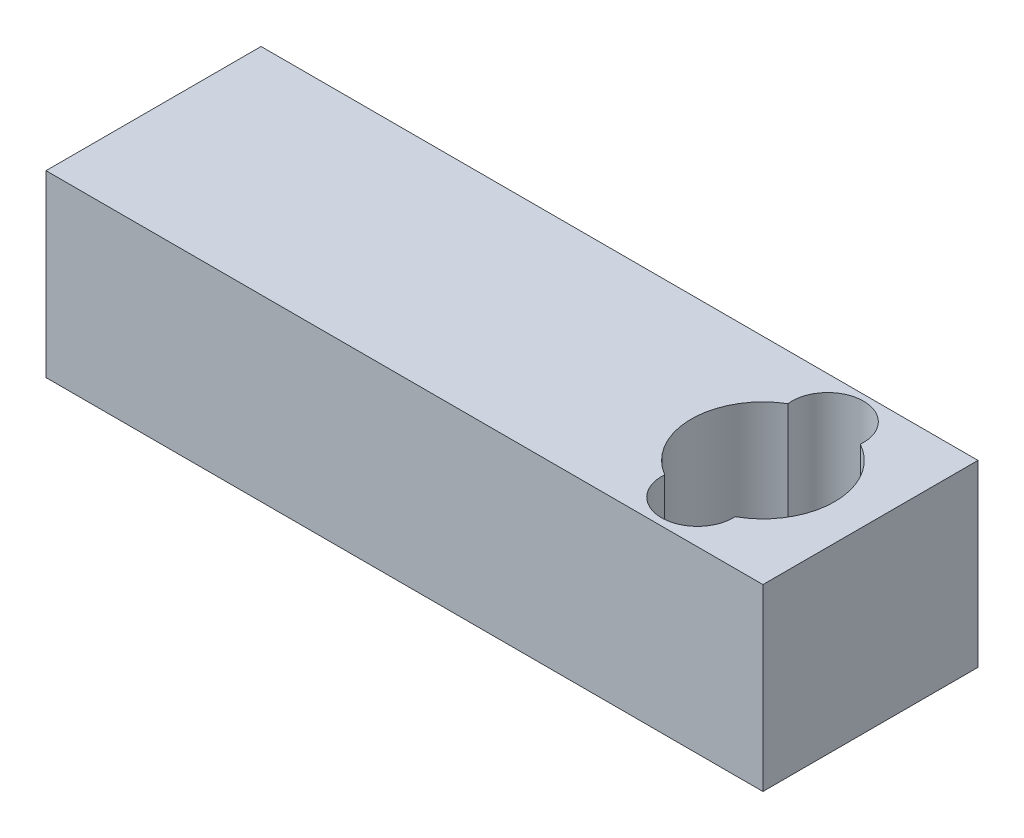
ISO-10303-21;
HEADER;
FILE_DESCRIPTION(('STEP AP214'),'2;1');
FILE_NAME('part.step','',(''),(''),'','','');
FILE_SCHEMA(('AUTOMOTIVE_DESIGN { 1 0 10303 214 1 1 1 1 }'));
ENDSEC;
DATA;
#1=APPLICATION_CONTEXT('core data for automotive mechanical design processes');
#2=APPLICATION_PROTOCOL_DEFINITION('international standard','automotive_design',2000,#1);
#3=PRODUCT_CONTEXT('',#1,'mechanical');
#4=PRODUCT('Part','Part','',(#3));
#5=PRODUCT_RELATED_PRODUCT_CATEGORY('part','',(#4));
#6=PRODUCT_DEFINITION_FORMATION('','',#4);
#7=PRODUCT_DEFINITION_CONTEXT('part definition',#1,'design');
#8=PRODUCT_DEFINITION('design','',#6,#7);
#9=PRODUCT_DEFINITION_SHAPE('','',#8);
#10=(LENGTH_UNIT() NAMED_UNIT(*) SI_UNIT(.MILLI.,.METRE.));
#11=(NAMED_UNIT(*) PLANE_ANGLE_UNIT() SI_UNIT($,.RADIAN.));
#12=(NAMED_UNIT(*) SI_UNIT($,.STERADIAN.) SOLID_ANGLE_UNIT());
#13=UNCERTAINTY_MEASURE_WITH_UNIT(LENGTH_MEASURE(1.E-05),#10,'distance_accuracy_value','');
#14=(GEOMETRIC_REPRESENTATION_CONTEXT(3) GLOBAL_UNCERTAINTY_ASSIGNED_CONTEXT((#13)) GLOBAL_UNIT_ASSIGNED_CONTEXT((#10,
#11,#12)) REPRESENTATION_CONTEXT('',''));
#15=CARTESIAN_POINT('',(0.,0.,0.));
#16=DIRECTION('',(0.,0.,1.));
#17=DIRECTION('',(1.,0.,0.));
#18=AXIS2_PLACEMENT_3D('',#15,#16,#17);
#19=CARTESIAN_POINT('',(50.,25.,0.));
#20=DIRECTION('',(1.,0.,0.));
#21=DIRECTION('',(0.,0.,-1.));
#22=AXIS2_PLACEMENT_3D('',#19,#20,#21);
#23=PLANE('',#22);
#24=DIRECTION('',(0.,0.,1.));
#25=VECTOR('',#24,1.);
#26=CARTESIAN_POINT('',(50.,0.,0.));
#27=LINE('',#26,#25);
#28=CARTESIAN_POINT('',(50.,0.,-15.));
#29=VERTEX_POINT('',#28);
#30=CARTESIAN_POINT('',(50.,0.,15.));
#31=VERTEX_POINT('',#30);
#32=EDGE_CURVE('E147',#29,#31,#27,.T.);
#33=ORIENTED_EDGE('',*,*,#32,.F.);
#34=DIRECTION('',(0.,-1.,0.));
#35=VECTOR('',#34,1.);
#36=CARTESIAN_POINT('',(50.,25.,-15.));
#37=LINE('',#36,#35);
#38=CARTESIAN_POINT('',(50.,25.,-15.));
#39=VERTEX_POINT('',#38);
#40=EDGE_CURVE('E11',#39,#29,#37,.T.);
#41=ORIENTED_EDGE('',*,*,#40,.F.);
#42=DIRECTION('',(0.,0.,1.));
#43=VECTOR('',#42,1.);
#44=CARTESIAN_POINT('',(50.,25.,0.));
#45=LINE('',#44,#43);
#46=CARTESIAN_POINT('',(50.,25.,15.));
#47=VERTEX_POINT('',#46);
#48=EDGE_CURVE('E129',#39,#47,#45,.T.);
#49=ORIENTED_EDGE('',*,*,#48,.T.);
#50=DIRECTION('',(0.,-1.,0.));
#51=VECTOR('',#50,1.);
#52=CARTESIAN_POINT('',(50.,25.,15.));
#53=LINE('',#52,#51);
#54=EDGE_CURVE('E91',#47,#31,#53,.T.);
#55=ORIENTED_EDGE('',*,*,#54,.T.);
#56=EDGE_LOOP('',(#33,#41,#49,#55));
#57=FACE_BOUND('',#56,.T.);
#58=ADVANCED_FACE('F37',(#57),#23,.T.);
#59=CARTESIAN_POINT('',(0.,25.,-15.));
#60=DIRECTION('',(0.,0.,-1.));
#61=DIRECTION('',(-1.,0.,0.));
#62=AXIS2_PLACEMENT_3D('',#59,#60,#61);
#63=PLANE('',#62);
#64=DIRECTION('',(1.,0.,0.));
#65=VECTOR('',#64,1.);
#66=CARTESIAN_POINT('',(0.,0.,-15.));
#67=LINE('',#66,#65);
#68=CARTESIAN_POINT('',(-50.,0.,-15.));
#69=VERTEX_POINT('',#68);
#70=EDGE_CURVE('E119',#69,#29,#67,.T.);
#71=ORIENTED_EDGE('',*,*,#70,.F.);
#72=DIRECTION('',(0.,-1.,0.));
#73=VECTOR('',#72,1.);
#74=CARTESIAN_POINT('',(-50.,25.,-15.));
#75=LINE('',#74,#73);
#76=CARTESIAN_POINT('',(-50.,25.,-15.));
#77=VERTEX_POINT('',#76);
#78=EDGE_CURVE('E47',#77,#69,#75,.T.);
#79=ORIENTED_EDGE('',*,*,#78,.F.);
#80=DIRECTION('',(1.,0.,0.));
#81=VECTOR('',#80,1.);
#82=CARTESIAN_POINT('',(0.,25.,-15.));
#83=LINE('',#82,#81);
#84=EDGE_CURVE('E117',#77,#39,#83,.T.);
#85=ORIENTED_EDGE('',*,*,#84,.T.);
#86=ORIENTED_EDGE('',*,*,#40,.T.);
#87=EDGE_LOOP('',(#71,#79,#85,#86));
#88=FACE_BOUND('',#87,.T.);
#89=ADVANCED_FACE('F115',(#88),#63,.T.);
#90=CARTESIAN_POINT('',(-50.,25.,0.));
#91=DIRECTION('',(1.,0.,0.));
#92=DIRECTION('',(0.,0.,-1.));
#93=AXIS2_PLACEMENT_3D('',#90,#91,#92);
#94=PLANE('',#93);
#95=DIRECTION('',(0.,0.,1.));
#96=VECTOR('',#95,1.);
#97=CARTESIAN_POINT('',(-50.,0.,0.));
#98=LINE('',#97,#96);
#99=CARTESIAN_POINT('',(-50.,0.,15.));
#100=VERTEX_POINT('',#99);
#101=EDGE_CURVE('E150',#69,#100,#98,.T.);
#102=ORIENTED_EDGE('',*,*,#101,.T.);
#103=DIRECTION('',(0.,-1.,0.));
#104=VECTOR('',#103,1.);
#105=CARTESIAN_POINT('',(-50.,25.,15.));
#106=LINE('',#105,#104);
#107=CARTESIAN_POINT('',(-50.,25.,15.));
#108=VERTEX_POINT('',#107);
#109=EDGE_CURVE('E122',#108,#100,#106,.T.);
#110=ORIENTED_EDGE('',*,*,#109,.F.);
#111=DIRECTION('',(0.,0.,1.));
#112=VECTOR('',#111,1.);
#113=CARTESIAN_POINT('',(-50.,25.,0.));
#114=LINE('',#113,#112);
#115=EDGE_CURVE('E125',#77,#108,#114,.T.);
#116=ORIENTED_EDGE('',*,*,#115,.F.);
#117=ORIENTED_EDGE('',*,*,#78,.T.);
#118=EDGE_LOOP('',(#102,#110,#116,#117));
#119=FACE_BOUND('',#118,.T.);
#120=ADVANCED_FACE('F126',(#119),#94,.F.);
#121=CARTESIAN_POINT('',(34.8709193944947,25.,9.00691121945326));
#122=DIRECTION('',(0.,-1.,0.));
#123=DIRECTION('',(0.,0.,-1.));
#124=AXIS2_PLACEMENT_3D('',#121,#122,#123);
#125=CYLINDRICAL_SURFACE('',#124,5.);
#126=CARTESIAN_POINT('',(34.8709193944947,0.,9.00691121945326));
#127=DIRECTION('',(0.,1.,0.));
#128=DIRECTION('',(0.,0.,1.));
#129=AXIS2_PLACEMENT_3D('',#126,#127,#128);
#130=CIRCLE('',#129,5.);
#131=CARTESIAN_POINT('',(29.8879494579652,0.,8.59458778858428));
#132=VERTEX_POINT('',#131);
#133=CARTESIAN_POINT('',(39.8636587115314,0.,8.73755251416235));
#134=VERTEX_POINT('',#133);
#135=EDGE_CURVE('E137',#132,#134,#130,.T.);
#136=ORIENTED_EDGE('',*,*,#135,.F.);
#137=DIRECTION('',(0.,-1.,0.));
#138=VECTOR('',#137,1.);
#139=CARTESIAN_POINT('',(29.8879494579652,25.,8.59458778858428));
#140=LINE('',#139,#138);
#141=CARTESIAN_POINT('',(29.8879494579652,25.,8.59458778858428));
#142=VERTEX_POINT('',#141);
#143=EDGE_CURVE('E41',#142,#132,#140,.T.);
#144=ORIENTED_EDGE('',*,*,#143,.F.);
#145=CARTESIAN_POINT('',(34.8709193944947,25.,9.00691121945326));
#146=DIRECTION('',(0.,1.,0.));
#147=DIRECTION('',(0.,0.,1.));
#148=AXIS2_PLACEMENT_3D('',#145,#146,#147);
#149=CIRCLE('',#148,5.);
#150=CARTESIAN_POINT('',(39.8636587115314,25.,8.73755251416235));
#151=VERTEX_POINT('',#150);
#152=EDGE_CURVE('E153',#142,#151,#149,.T.);
#153=ORIENTED_EDGE('',*,*,#152,.T.);
#154=DIRECTION('',(0.,-1.,0.));
#155=VECTOR('',#154,1.);
#156=CARTESIAN_POINT('',(39.8636587115314,25.,8.73755251416235));
#157=LINE('',#156,#155);
#158=EDGE_CURVE('E136',#151,#134,#157,.T.);
#159=ORIENTED_EDGE('',*,*,#158,.T.);
#160=EDGE_LOOP('',(#136,#144,#153,#159));
#161=FACE_BOUND('',#160,.T.);
#162=ADVANCED_FACE('F39',(#161),#125,.F.);
#163=CARTESIAN_POINT('',(35.,25.,0.));
#164=DIRECTION('',(0.,-1.,0.));
#165=DIRECTION('',(0.,0.,-1.));
#166=AXIS2_PLACEMENT_3D('',#163,#164,#165);
#167=CYLINDRICAL_SURFACE('',#166,10.);
#168=CARTESIAN_POINT('',(35.,0.,0.));
#169=DIRECTION('',(0.,1.,0.));
#170=DIRECTION('',(0.,0.,1.));
#171=AXIS2_PLACEMENT_3D('',#168,#169,#170);
#172=CIRCLE('',#171,10.);
#173=CARTESIAN_POINT('',(29.8879494579652,0.,-8.59458778858429));
#174=VERTEX_POINT('',#173);
#175=EDGE_CURVE('E140',#174,#132,#172,.T.);
#176=ORIENTED_EDGE('',*,*,#175,.F.);
#177=DIRECTION('',(0.,-1.,0.));
#178=VECTOR('',#177,1.);
#179=CARTESIAN_POINT('',(29.8879494579652,25.,-8.59458778858429));
#180=LINE('',#179,#178);
#181=CARTESIAN_POINT('',(29.8879494579652,25.,-8.59458778858429));
#182=VERTEX_POINT('',#181);
#183=EDGE_CURVE('E158',#182,#174,#180,.T.);
#184=ORIENTED_EDGE('',*,*,#183,.F.);
#185=CARTESIAN_POINT('',(35.,25.,0.));
#186=DIRECTION('',(0.,1.,0.));
#187=DIRECTION('',(0.,0.,1.));
#188=AXIS2_PLACEMENT_3D('',#185,#186,#187);
#189=CIRCLE('',#188,10.);
#190=EDGE_CURVE('E167',#182,#142,#189,.T.);
#191=ORIENTED_EDGE('',*,*,#190,.T.);
#192=ORIENTED_EDGE('',*,*,#143,.T.);
#193=EDGE_LOOP('',(#176,#184,#191,#192));
#194=FACE_BOUND('',#193,.T.);
#195=ADVANCED_FACE('F165',(#194),#167,.F.);
#196=CARTESIAN_POINT('',(34.8530861902551,25.,-9.18400888564987));
#197=DIRECTION('',(0.,-1.,0.));
#198=DIRECTION('',(0.,0.,-1.));
#199=AXIS2_PLACEMENT_3D('',#196,#197,#198);
#200=CYLINDRICAL_SURFACE('',#199,4.99999999999998);
#201=CARTESIAN_POINT('',(34.8530861902551,0.,-9.18400888564987));
#202=DIRECTION('',(0.,1.,0.));
#203=DIRECTION('',(0.,0.,1.));
#204=AXIS2_PLACEMENT_3D('',#201,#202,#203);
#205=CIRCLE('',#204,4.99999999999998);
#206=CARTESIAN_POINT('',(39.8345352294043,0.,-8.75370030990599));
#207=VERTEX_POINT('',#206);
#208=EDGE_CURVE('E143',#174,#207,#205,.F.);
#209=ORIENTED_EDGE('',*,*,#208,.T.);
#210=DIRECTION('',(0.,-1.,0.));
#211=VECTOR('',#210,1.);
#212=CARTESIAN_POINT('',(39.8345352294043,25.,-8.75370030990599));
#213=LINE('',#212,#211);
#214=CARTESIAN_POINT('',(39.8345352294043,25.,-8.75370030990599));
#215=VERTEX_POINT('',#214);
#216=EDGE_CURVE('E157',#215,#207,#213,.T.);
#217=ORIENTED_EDGE('',*,*,#216,.F.);
#218=CARTESIAN_POINT('',(34.8530861902551,25.,-9.18400888564987));
#219=DIRECTION('',(0.,1.,0.));
#220=DIRECTION('',(0.,0.,1.));
#221=AXIS2_PLACEMENT_3D('',#218,#219,#220);
#222=CIRCLE('',#221,4.99999999999998);
#223=EDGE_CURVE('E175',#182,#215,#222,.F.);
#224=ORIENTED_EDGE('',*,*,#223,.F.);
#225=ORIENTED_EDGE('',*,*,#183,.T.);
#226=EDGE_LOOP('',(#209,#217,#224,#225));
#227=FACE_BOUND('',#226,.T.);
#228=ADVANCED_FACE('F173',(#227),#200,.F.);
#229=EDGE_CURVE('E144',#134,#207,#172,.T.);
#230=ORIENTED_EDGE('',*,*,#229,.F.);
#231=ORIENTED_EDGE('',*,*,#158,.F.);
#232=EDGE_CURVE('E131',#151,#215,#189,.T.);
#233=ORIENTED_EDGE('',*,*,#232,.T.);
#234=ORIENTED_EDGE('',*,*,#216,.T.);
#235=EDGE_LOOP('',(#230,#231,#233,#234));
#236=FACE_BOUND('',#235,.T.);
#237=ADVANCED_FACE('F178',(#236),#167,.F.);
#238=CARTESIAN_POINT('',(0.,25.,15.));
#239=DIRECTION('',(0.,0.,-1.));
#240=DIRECTION('',(-1.,0.,0.));
#241=AXIS2_PLACEMENT_3D('',#238,#239,#240);
#242=PLANE('',#241);
#243=DIRECTION('',(1.,0.,0.));
#244=VECTOR('',#243,1.);
#245=CARTESIAN_POINT('',(0.,0.,15.));
#246=LINE('',#245,#244);
#247=EDGE_CURVE('E84',#100,#31,#246,.T.);
#248=ORIENTED_EDGE('',*,*,#247,.T.);
#249=ORIENTED_EDGE('',*,*,#54,.F.);
#250=DIRECTION('',(1.,0.,0.));
#251=VECTOR('',#250,1.);
#252=CARTESIAN_POINT('',(0.,25.,15.));
#253=LINE('',#252,#251);
#254=EDGE_CURVE('E56',#108,#47,#253,.T.);
#255=ORIENTED_EDGE('',*,*,#254,.F.);
#256=ORIENTED_EDGE('',*,*,#109,.T.);
#257=EDGE_LOOP('',(#248,#249,#255,#256));
#258=FACE_BOUND('',#257,.T.);
#259=ADVANCED_FACE('F183',(#258),#242,.F.);
#260=CARTESIAN_POINT('',(0.,25.,0.));
#261=DIRECTION('',(0.,1.,0.));
#262=DIRECTION('',(0.,0.,1.));
#263=AXIS2_PLACEMENT_3D('',#260,#261,#262);
#264=PLANE('',#263);
#265=ORIENTED_EDGE('',*,*,#152,.F.);
#266=ORIENTED_EDGE('',*,*,#190,.F.);
#267=ORIENTED_EDGE('',*,*,#223,.T.);
#268=ORIENTED_EDGE('',*,*,#232,.F.);
#269=EDGE_LOOP('',(#265,#266,#267,#268));
#270=FACE_BOUND('',#269,.T.);
#271=ORIENTED_EDGE('',*,*,#48,.F.);
#272=ORIENTED_EDGE('',*,*,#84,.F.);
#273=ORIENTED_EDGE('',*,*,#115,.T.);
#274=ORIENTED_EDGE('',*,*,#254,.T.);
#275=EDGE_LOOP('',(#271,#272,#273,#274));
#276=FACE_BOUND('',#275,.T.);
#277=ADVANCED_FACE('F128',(#270,#276),#264,.T.);
#278=CARTESIAN_POINT('',(0.,0.,0.));
#279=DIRECTION('',(0.,1.,0.));
#280=DIRECTION('',(0.,0.,1.));
#281=AXIS2_PLACEMENT_3D('',#278,#279,#280);
#282=PLANE('',#281);
#283=ORIENTED_EDGE('',*,*,#135,.T.);
#284=ORIENTED_EDGE('',*,*,#229,.T.);
#285=ORIENTED_EDGE('',*,*,#208,.F.);
#286=ORIENTED_EDGE('',*,*,#175,.T.);
#287=EDGE_LOOP('',(#283,#284,#285,#286));
#288=FACE_BOUND('',#287,.T.);
#289=ORIENTED_EDGE('',*,*,#32,.T.);
#290=ORIENTED_EDGE('',*,*,#247,.F.);
#291=ORIENTED_EDGE('',*,*,#101,.F.);
#292=ORIENTED_EDGE('',*,*,#70,.T.);
#293=EDGE_LOOP('',(#289,#290,#291,#292));
#294=FACE_BOUND('',#293,.T.);
#295=ADVANCED_FACE('F171',(#288,#294),#282,.F.);
#296=CLOSED_SHELL('',(#58,#89,#120,#162,#195,#228,#237,#259,#277,#295));
#297=MANIFOLD_SOLID_BREP('B2',#296);
#298=ADVANCED_BREP_SHAPE_REPRESENTATION('',(#18,#297),#14);
#299=SHAPE_DEFINITION_REPRESENTATION(#9,#298);
ENDSEC;
END-ISO-10303-21;
